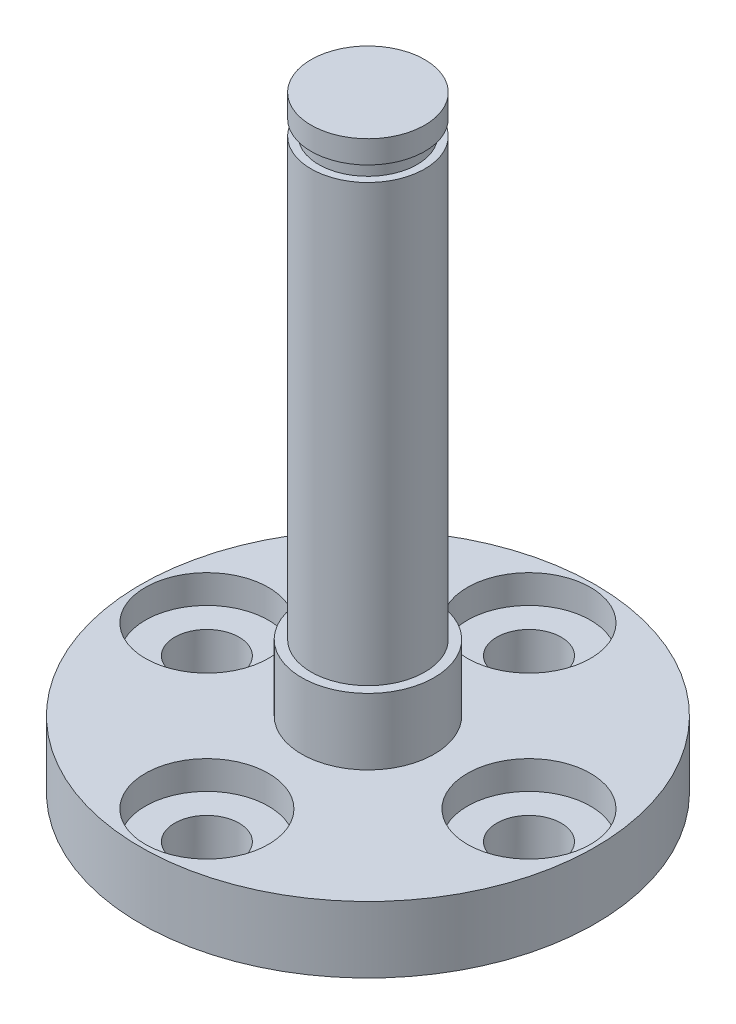
ISO-10303-21;
HEADER;
FILE_DESCRIPTION(('STEP AP214'),'2;1');
FILE_NAME('part.step','',(''),(''),'','','');
FILE_SCHEMA(('AUTOMOTIVE_DESIGN { 1 0 10303 214 1 1 1 1 }'));
ENDSEC;
DATA;
#1=APPLICATION_CONTEXT('core data for automotive mechanical design processes');
#2=APPLICATION_PROTOCOL_DEFINITION('international standard','automotive_design',2000,#1);
#3=PRODUCT_CONTEXT('',#1,'mechanical');
#4=PRODUCT('Part','Part','',(#3));
#5=PRODUCT_RELATED_PRODUCT_CATEGORY('part','',(#4));
#6=PRODUCT_DEFINITION_FORMATION('','',#4);
#7=PRODUCT_DEFINITION_CONTEXT('part definition',#1,'design');
#8=PRODUCT_DEFINITION('design','',#6,#7);
#9=PRODUCT_DEFINITION_SHAPE('','',#8);
#10=(LENGTH_UNIT() NAMED_UNIT(*) SI_UNIT(.MILLI.,.METRE.));
#11=(NAMED_UNIT(*) PLANE_ANGLE_UNIT() SI_UNIT($,.RADIAN.));
#12=(NAMED_UNIT(*) SI_UNIT($,.STERADIAN.) SOLID_ANGLE_UNIT());
#13=UNCERTAINTY_MEASURE_WITH_UNIT(LENGTH_MEASURE(1.E-05),#10,'distance_accuracy_value','');
#14=(GEOMETRIC_REPRESENTATION_CONTEXT(3) GLOBAL_UNCERTAINTY_ASSIGNED_CONTEXT((#13)) GLOBAL_UNIT_ASSIGNED_CONTEXT((#10,
#11,#12)) REPRESENTATION_CONTEXT('',''));
#15=CARTESIAN_POINT('',(0.,0.,0.));
#16=DIRECTION('',(0.,0.,1.));
#17=DIRECTION('',(1.,0.,0.));
#18=AXIS2_PLACEMENT_3D('',#15,#16,#17);
#19=CARTESIAN_POINT('',(0.,-3.5,0.));
#20=DIRECTION('',(0.,-1.,0.));
#21=DIRECTION('',(0.,0.,-1.));
#22=AXIS2_PLACEMENT_3D('',#19,#20,#21);
#23=PLANE('',#22);
#24=CARTESIAN_POINT('',(0.,-3.5,-8.5));
#25=DIRECTION('',(0.,-1.,0.));
#26=DIRECTION('',(0.,0.,-1.));
#27=AXIS2_PLACEMENT_3D('',#24,#25,#26);
#28=CIRCLE('',#27,1.7);
#29=CARTESIAN_POINT('',(0.,-3.5,-10.2));
#30=VERTEX_POINT('',#29);
#31=EDGE_CURVE('E40',#30,#30,#28,.T.);
#32=ORIENTED_EDGE('',*,*,#31,.F.);
#33=EDGE_LOOP('',(#32));
#34=FACE_BOUND('',#33,.T.);
#35=CARTESIAN_POINT('',(-8.5,-3.5,0.));
#36=DIRECTION('',(0.,-1.,0.));
#37=DIRECTION('',(0.,0.,-1.));
#38=AXIS2_PLACEMENT_3D('',#35,#36,#37);
#39=CIRCLE('',#38,1.7);
#40=CARTESIAN_POINT('',(-8.5,-3.5,-1.7));
#41=VERTEX_POINT('',#40);
#42=EDGE_CURVE('E67',#41,#41,#39,.T.);
#43=ORIENTED_EDGE('',*,*,#42,.F.);
#44=EDGE_LOOP('',(#43));
#45=FACE_BOUND('',#44,.T.);
#46=CARTESIAN_POINT('',(0.,-3.5,8.5));
#47=DIRECTION('',(0.,-1.,0.));
#48=DIRECTION('',(0.,0.,-1.));
#49=AXIS2_PLACEMENT_3D('',#46,#47,#48);
#50=CIRCLE('',#49,1.7);
#51=CARTESIAN_POINT('',(0.,-3.5,6.8));
#52=VERTEX_POINT('',#51);
#53=EDGE_CURVE('E62',#52,#52,#50,.T.);
#54=ORIENTED_EDGE('',*,*,#53,.F.);
#55=EDGE_LOOP('',(#54));
#56=FACE_BOUND('',#55,.T.);
#57=CARTESIAN_POINT('',(8.5,-3.5,0.));
#58=DIRECTION('',(0.,-1.,0.));
#59=DIRECTION('',(0.,0.,-1.));
#60=AXIS2_PLACEMENT_3D('',#57,#58,#59);
#61=CIRCLE('',#60,1.7);
#62=CARTESIAN_POINT('',(8.5,-3.5,-1.7));
#63=VERTEX_POINT('',#62);
#64=EDGE_CURVE('E56',#63,#63,#61,.T.);
#65=ORIENTED_EDGE('',*,*,#64,.F.);
#66=EDGE_LOOP('',(#65));
#67=FACE_BOUND('',#66,.T.);
#68=CARTESIAN_POINT('',(0.,-3.5,0.));
#69=DIRECTION('',(0.,-1.,0.));
#70=DIRECTION('',(0.,0.,-1.));
#71=AXIS2_PLACEMENT_3D('',#68,#69,#70);
#72=CIRCLE('',#71,12.);
#73=CARTESIAN_POINT('',(0.,-3.5,-12.));
#74=VERTEX_POINT('',#73);
#75=EDGE_CURVE('E114',#74,#74,#72,.T.);
#76=ORIENTED_EDGE('',*,*,#75,.T.);
#77=EDGE_LOOP('',(#76));
#78=FACE_BOUND('',#77,.T.);
#79=CARTESIAN_POINT('',(0.,-3.5,0.));
#80=DIRECTION('',(0.,-1.,0.));
#81=DIRECTION('',(0.,0.,-1.));
#82=AXIS2_PLACEMENT_3D('',#79,#80,#81);
#83=CIRCLE('',#82,2.95);
#84=CARTESIAN_POINT('',(0.,-3.5,-2.95));
#85=VERTEX_POINT('',#84);
#86=EDGE_CURVE('E60',#85,#85,#83,.T.);
#87=ORIENTED_EDGE('',*,*,#86,.F.);
#88=EDGE_LOOP('',(#87));
#89=FACE_BOUND('',#88,.T.);
#90=ADVANCED_FACE('F36',(#34,#45,#56,#67,#78,#89),#23,.T.);
#91=CARTESIAN_POINT('',(0.,0.,0.));
#92=DIRECTION('',(0.,-1.,0.));
#93=DIRECTION('',(0.,0.,-1.));
#94=AXIS2_PLACEMENT_3D('',#91,#92,#93);
#95=CYLINDRICAL_SURFACE('',#94,3.50000000000001);
#96=CARTESIAN_POINT('',(0.,3.5,0.));
#97=DIRECTION('',(0.,-1.,0.));
#98=DIRECTION('',(0.,0.,-1.));
#99=AXIS2_PLACEMENT_3D('',#96,#97,#98);
#100=CIRCLE('',#99,3.5);
#101=CARTESIAN_POINT('',(0.,3.5,-3.5));
#102=VERTEX_POINT('',#101);
#103=EDGE_CURVE('E45',#102,#102,#100,.T.);
#104=ORIENTED_EDGE('',*,*,#103,.T.);
#105=EDGE_LOOP('',(#104));
#106=FACE_BOUND('',#105,.T.);
#107=CARTESIAN_POINT('',(0.,0.,0.));
#108=DIRECTION('',(0.,-1.,0.));
#109=DIRECTION('',(0.,0.,-1.));
#110=AXIS2_PLACEMENT_3D('',#107,#108,#109);
#111=CIRCLE('',#110,3.50000000000001);
#112=CARTESIAN_POINT('',(0.,0.,-3.50000000000001));
#113=VERTEX_POINT('',#112);
#114=EDGE_CURVE('E10',#113,#113,#111,.T.);
#115=ORIENTED_EDGE('',*,*,#114,.F.);
#116=EDGE_LOOP('',(#115));
#117=FACE_BOUND('',#116,.T.);
#118=ADVANCED_FACE('F38',(#106,#117),#95,.T.);
#119=CARTESIAN_POINT('',(3.5,3.5,0.));
#120=DIRECTION('',(0.,1.,0.));
#121=DIRECTION('',(0.,0.,1.));
#122=AXIS2_PLACEMENT_3D('',#119,#120,#121);
#123=PLANE('',#122);
#124=CARTESIAN_POINT('',(0.,3.5,0.));
#125=DIRECTION('',(0.,-1.,0.));
#126=DIRECTION('',(0.,0.,-1.));
#127=AXIS2_PLACEMENT_3D('',#124,#125,#126);
#128=CIRCLE('',#127,3.);
#129=CARTESIAN_POINT('',(0.,3.5,-3.));
#130=VERTEX_POINT('',#129);
#131=EDGE_CURVE('E52',#130,#130,#128,.T.);
#132=ORIENTED_EDGE('',*,*,#131,.T.);
#133=EDGE_LOOP('',(#132));
#134=FACE_BOUND('',#133,.T.);
#135=ORIENTED_EDGE('',*,*,#103,.F.);
#136=EDGE_LOOP('',(#135));
#137=FACE_BOUND('',#136,.T.);
#138=ADVANCED_FACE('F143',(#134,#137),#123,.T.);
#139=CARTESIAN_POINT('',(0.,0.,0.));
#140=DIRECTION('',(0.,-1.,0.));
#141=DIRECTION('',(0.,0.,-1.));
#142=AXIS2_PLACEMENT_3D('',#139,#140,#141);
#143=CYLINDRICAL_SURFACE('',#142,3.);
#144=CARTESIAN_POINT('',(0.,26.5,0.));
#145=DIRECTION('',(0.,-1.,0.));
#146=DIRECTION('',(0.,0.,-1.));
#147=AXIS2_PLACEMENT_3D('',#144,#145,#146);
#148=CIRCLE('',#147,3.);
#149=CARTESIAN_POINT('',(0.,26.5,-3.));
#150=VERTEX_POINT('',#149);
#151=EDGE_CURVE('E137',#150,#150,#148,.T.);
#152=ORIENTED_EDGE('',*,*,#151,.T.);
#153=EDGE_LOOP('',(#152));
#154=FACE_BOUND('',#153,.T.);
#155=ORIENTED_EDGE('',*,*,#131,.F.);
#156=EDGE_LOOP('',(#155));
#157=FACE_BOUND('',#156,.T.);
#158=ADVANCED_FACE('F146',(#154,#157),#143,.T.);
#159=CARTESIAN_POINT('',(3.,26.5,0.));
#160=DIRECTION('',(0.,1.,0.));
#161=DIRECTION('',(0.,0.,1.));
#162=AXIS2_PLACEMENT_3D('',#159,#160,#161);
#163=PLANE('',#162);
#164=CARTESIAN_POINT('',(0.,26.5,0.));
#165=DIRECTION('',(0.,-1.,0.));
#166=DIRECTION('',(0.,0.,-1.));
#167=AXIS2_PLACEMENT_3D('',#164,#165,#166);
#168=CIRCLE('',#167,2.6);
#169=CARTESIAN_POINT('',(0.,26.5,-2.6));
#170=VERTEX_POINT('',#169);
#171=EDGE_CURVE('E133',#170,#170,#168,.T.);
#172=ORIENTED_EDGE('',*,*,#171,.T.);
#173=EDGE_LOOP('',(#172));
#174=FACE_BOUND('',#173,.T.);
#175=ORIENTED_EDGE('',*,*,#151,.F.);
#176=EDGE_LOOP('',(#175));
#177=FACE_BOUND('',#176,.T.);
#178=ADVANCED_FACE('F148',(#174,#177),#163,.T.);
#179=CARTESIAN_POINT('',(0.,0.,0.));
#180=DIRECTION('',(0.,-1.,0.));
#181=DIRECTION('',(0.,0.,-1.));
#182=AXIS2_PLACEMENT_3D('',#179,#180,#181);
#183=CYLINDRICAL_SURFACE('',#182,2.6);
#184=CARTESIAN_POINT('',(0.,27.3,0.));
#185=DIRECTION('',(0.,-1.,0.));
#186=DIRECTION('',(0.,0.,-1.));
#187=AXIS2_PLACEMENT_3D('',#184,#185,#186);
#188=CIRCLE('',#187,2.6);
#189=CARTESIAN_POINT('',(0.,27.3,-2.6));
#190=VERTEX_POINT('',#189);
#191=EDGE_CURVE('E129',#190,#190,#188,.T.);
#192=ORIENTED_EDGE('',*,*,#191,.T.);
#193=EDGE_LOOP('',(#192));
#194=FACE_BOUND('',#193,.T.);
#195=ORIENTED_EDGE('',*,*,#171,.F.);
#196=EDGE_LOOP('',(#195));
#197=FACE_BOUND('',#196,.T.);
#198=ADVANCED_FACE('F155',(#194,#197),#183,.T.);
#199=CARTESIAN_POINT('',(3.,27.3,0.));
#200=DIRECTION('',(0.,-1.,0.));
#201=DIRECTION('',(0.,0.,-1.));
#202=AXIS2_PLACEMENT_3D('',#199,#200,#201);
#203=PLANE('',#202);
#204=CARTESIAN_POINT('',(0.,27.3,0.));
#205=DIRECTION('',(0.,-1.,0.));
#206=DIRECTION('',(0.,0.,-1.));
#207=AXIS2_PLACEMENT_3D('',#204,#205,#206);
#208=CIRCLE('',#207,3.);
#209=CARTESIAN_POINT('',(0.,27.3,-3.));
#210=VERTEX_POINT('',#209);
#211=EDGE_CURVE('E125',#210,#210,#208,.T.);
#212=ORIENTED_EDGE('',*,*,#211,.T.);
#213=EDGE_LOOP('',(#212));
#214=FACE_BOUND('',#213,.T.);
#215=ORIENTED_EDGE('',*,*,#191,.F.);
#216=EDGE_LOOP('',(#215));
#217=FACE_BOUND('',#216,.T.);
#218=ADVANCED_FACE('F186',(#214,#217),#203,.T.);
#219=CARTESIAN_POINT('',(0.,0.,0.));
#220=DIRECTION('',(0.,-1.,0.));
#221=DIRECTION('',(0.,0.,-1.));
#222=AXIS2_PLACEMENT_3D('',#219,#220,#221);
#223=CYLINDRICAL_SURFACE('',#222,3.);
#224=CARTESIAN_POINT('',(0.,28.5,0.));
#225=DIRECTION('',(0.,-1.,0.));
#226=DIRECTION('',(0.,0.,-1.));
#227=AXIS2_PLACEMENT_3D('',#224,#225,#226);
#228=CIRCLE('',#227,3.);
#229=CARTESIAN_POINT('',(0.,28.5,-3.));
#230=VERTEX_POINT('',#229);
#231=EDGE_CURVE('E118',#230,#230,#228,.T.);
#232=ORIENTED_EDGE('',*,*,#231,.T.);
#233=EDGE_LOOP('',(#232));
#234=FACE_BOUND('',#233,.T.);
#235=ORIENTED_EDGE('',*,*,#211,.F.);
#236=EDGE_LOOP('',(#235));
#237=FACE_BOUND('',#236,.T.);
#238=ADVANCED_FACE('F182',(#234,#237),#223,.T.);
#239=CARTESIAN_POINT('',(3.,28.5,0.));
#240=DIRECTION('',(0.,1.,0.));
#241=DIRECTION('',(0.,0.,1.));
#242=AXIS2_PLACEMENT_3D('',#239,#240,#241);
#243=PLANE('',#242);
#244=ORIENTED_EDGE('',*,*,#231,.F.);
#245=EDGE_LOOP('',(#244));
#246=FACE_BOUND('',#245,.T.);
#247=ADVANCED_FACE('F178',(#246),#243,.T.);
#248=CARTESIAN_POINT('',(0.,-3.5,0.));
#249=DIRECTION('',(0.,1.,0.));
#250=DIRECTION('',(0.,0.,1.));
#251=AXIS2_PLACEMENT_3D('',#248,#249,#250);
#252=CYLINDRICAL_SURFACE('',#251,12.);
#253=ORIENTED_EDGE('',*,*,#75,.F.);
#254=EDGE_LOOP('',(#253));
#255=FACE_BOUND('',#254,.T.);
#256=CARTESIAN_POINT('',(0.,0.,0.));
#257=DIRECTION('',(0.,-1.,0.));
#258=DIRECTION('',(0.,0.,-1.));
#259=AXIS2_PLACEMENT_3D('',#256,#257,#258);
#260=CIRCLE('',#259,12.);
#261=CARTESIAN_POINT('',(0.,0.,-12.));
#262=VERTEX_POINT('',#261);
#263=EDGE_CURVE('E110',#262,#262,#260,.T.);
#264=ORIENTED_EDGE('',*,*,#263,.T.);
#265=EDGE_LOOP('',(#264));
#266=FACE_BOUND('',#265,.T.);
#267=ADVANCED_FACE('F174',(#255,#266),#252,.T.);
#268=CARTESIAN_POINT('',(0.,0.,0.));
#269=DIRECTION('',(0.,-1.,0.));
#270=DIRECTION('',(0.,0.,-1.));
#271=AXIS2_PLACEMENT_3D('',#268,#269,#270);
#272=PLANE('',#271);
#273=CARTESIAN_POINT('',(0.,0.,-8.5));
#274=DIRECTION('',(0.,1.,0.));
#275=DIRECTION('',(0.,0.,1.));
#276=AXIS2_PLACEMENT_3D('',#273,#274,#275);
#277=CIRCLE('',#276,3.25);
#278=CARTESIAN_POINT('',(0.,0.,-5.25));
#279=VERTEX_POINT('',#278);
#280=EDGE_CURVE('E428',#279,#279,#277,.T.);
#281=ORIENTED_EDGE('',*,*,#280,.F.);
#282=EDGE_LOOP('',(#281));
#283=FACE_BOUND('',#282,.T.);
#284=CARTESIAN_POINT('',(-8.5,0.,0.));
#285=DIRECTION('',(0.,1.,0.));
#286=DIRECTION('',(0.,0.,1.));
#287=AXIS2_PLACEMENT_3D('',#284,#285,#286);
#288=CIRCLE('',#287,3.25);
#289=CARTESIAN_POINT('',(-8.5,0.,3.25));
#290=VERTEX_POINT('',#289);
#291=EDGE_CURVE('E88',#290,#290,#288,.T.);
#292=ORIENTED_EDGE('',*,*,#291,.F.);
#293=EDGE_LOOP('',(#292));
#294=FACE_BOUND('',#293,.T.);
#295=CARTESIAN_POINT('',(0.,0.,8.5));
#296=DIRECTION('',(0.,1.,0.));
#297=DIRECTION('',(0.,0.,1.));
#298=AXIS2_PLACEMENT_3D('',#295,#296,#297);
#299=CIRCLE('',#298,3.25);
#300=CARTESIAN_POINT('',(0.,0.,11.75));
#301=VERTEX_POINT('',#300);
#302=EDGE_CURVE('E70',#301,#301,#299,.T.);
#303=ORIENTED_EDGE('',*,*,#302,.F.);
#304=EDGE_LOOP('',(#303));
#305=FACE_BOUND('',#304,.T.);
#306=CARTESIAN_POINT('',(8.5,0.,0.));
#307=DIRECTION('',(0.,1.,0.));
#308=DIRECTION('',(0.,0.,1.));
#309=AXIS2_PLACEMENT_3D('',#306,#307,#308);
#310=CIRCLE('',#309,3.25);
#311=CARTESIAN_POINT('',(8.5,0.,3.25));
#312=VERTEX_POINT('',#311);
#313=EDGE_CURVE('E65',#312,#312,#310,.T.);
#314=ORIENTED_EDGE('',*,*,#313,.F.);
#315=EDGE_LOOP('',(#314));
#316=FACE_BOUND('',#315,.T.);
#317=ORIENTED_EDGE('',*,*,#114,.T.);
#318=EDGE_LOOP('',(#317));
#319=FACE_BOUND('',#318,.T.);
#320=ORIENTED_EDGE('',*,*,#263,.F.);
#321=EDGE_LOOP('',(#320));
#322=FACE_BOUND('',#321,.T.);
#323=ADVANCED_FACE('F171',(#283,#294,#305,#316,#319,#322),#272,.F.);
#324=CARTESIAN_POINT('',(0.,-5.5,0.));
#325=DIRECTION('',(0.,1.,0.));
#326=DIRECTION('',(0.,0.,1.));
#327=AXIS2_PLACEMENT_3D('',#324,#325,#326);
#328=CYLINDRICAL_SURFACE('',#327,2.95);
#329=CARTESIAN_POINT('',(0.,-5.5,0.));
#330=DIRECTION('',(0.,-1.,0.));
#331=DIRECTION('',(0.,0.,-1.));
#332=AXIS2_PLACEMENT_3D('',#329,#330,#331);
#333=CIRCLE('',#332,2.95);
#334=CARTESIAN_POINT('',(0.,-5.5,-2.95));
#335=VERTEX_POINT('',#334);
#336=EDGE_CURVE('E106',#335,#335,#333,.T.);
#337=ORIENTED_EDGE('',*,*,#336,.F.);
#338=EDGE_LOOP('',(#337));
#339=FACE_BOUND('',#338,.T.);
#340=ORIENTED_EDGE('',*,*,#86,.T.);
#341=EDGE_LOOP('',(#340));
#342=FACE_BOUND('',#341,.T.);
#343=ADVANCED_FACE('F169',(#339,#342),#328,.T.);
#344=CARTESIAN_POINT('',(0.,-5.5,0.));
#345=DIRECTION('',(0.,-1.,0.));
#346=DIRECTION('',(0.,0.,-1.));
#347=AXIS2_PLACEMENT_3D('',#344,#345,#346);
#348=PLANE('',#347);
#349=ORIENTED_EDGE('',*,*,#336,.T.);
#350=EDGE_LOOP('',(#349));
#351=FACE_BOUND('',#350,.T.);
#352=ADVANCED_FACE('F223',(#351),#348,.T.);
#353=CARTESIAN_POINT('',(8.5,0.,0.));
#354=DIRECTION('',(0.,1.,0.));
#355=DIRECTION('',(0.,0.,1.));
#356=AXIS2_PLACEMENT_3D('',#353,#354,#355);
#357=CYLINDRICAL_SURFACE('',#356,1.7);
#358=ORIENTED_EDGE('',*,*,#64,.T.);
#359=EDGE_LOOP('',(#358));
#360=FACE_BOUND('',#359,.T.);
#361=CARTESIAN_POINT('',(8.5,-1.5,0.));
#362=DIRECTION('',(0.,1.,0.));
#363=DIRECTION('',(0.,0.,1.));
#364=AXIS2_PLACEMENT_3D('',#361,#362,#363);
#365=CIRCLE('',#364,1.7);
#366=CARTESIAN_POINT('',(8.5,-1.5,1.7));
#367=VERTEX_POINT('',#366);
#368=EDGE_CURVE('E61',#367,#367,#365,.T.);
#369=ORIENTED_EDGE('',*,*,#368,.T.);
#370=EDGE_LOOP('',(#369));
#371=FACE_BOUND('',#370,.T.);
#372=ADVANCED_FACE('F229',(#360,#371),#357,.F.);
#373=CARTESIAN_POINT('',(10.2,-1.5,0.));
#374=DIRECTION('',(0.,-1.,0.));
#375=DIRECTION('',(0.,0.,-1.));
#376=AXIS2_PLACEMENT_3D('',#373,#374,#375);
#377=PLANE('',#376);
#378=ORIENTED_EDGE('',*,*,#368,.F.);
#379=EDGE_LOOP('',(#378));
#380=FACE_BOUND('',#379,.T.);
#381=CARTESIAN_POINT('',(8.5,-1.5,0.));
#382=DIRECTION('',(0.,1.,0.));
#383=DIRECTION('',(0.,0.,1.));
#384=AXIS2_PLACEMENT_3D('',#381,#382,#383);
#385=CIRCLE('',#384,3.25);
#386=CARTESIAN_POINT('',(8.5,-1.5,3.25));
#387=VERTEX_POINT('',#386);
#388=EDGE_CURVE('E100',#387,#387,#385,.T.);
#389=ORIENTED_EDGE('',*,*,#388,.T.);
#390=EDGE_LOOP('',(#389));
#391=FACE_BOUND('',#390,.T.);
#392=ADVANCED_FACE('F235',(#380,#391),#377,.F.);
#393=CARTESIAN_POINT('',(8.5,0.,0.));
#394=DIRECTION('',(0.,1.,0.));
#395=DIRECTION('',(0.,0.,1.));
#396=AXIS2_PLACEMENT_3D('',#393,#394,#395);
#397=CYLINDRICAL_SURFACE('',#396,3.25);
#398=ORIENTED_EDGE('',*,*,#388,.F.);
#399=EDGE_LOOP('',(#398));
#400=FACE_BOUND('',#399,.T.);
#401=ORIENTED_EDGE('',*,*,#313,.T.);
#402=EDGE_LOOP('',(#401));
#403=FACE_BOUND('',#402,.T.);
#404=ADVANCED_FACE('F242',(#400,#403),#397,.F.);
#405=CARTESIAN_POINT('',(0.,0.,8.5));
#406=DIRECTION('',(0.,1.,0.));
#407=DIRECTION('',(0.,0.,1.));
#408=AXIS2_PLACEMENT_3D('',#405,#406,#407);
#409=CYLINDRICAL_SURFACE('',#408,1.7);
#410=ORIENTED_EDGE('',*,*,#53,.T.);
#411=EDGE_LOOP('',(#410));
#412=FACE_BOUND('',#411,.T.);
#413=CARTESIAN_POINT('',(0.,-1.5,8.5));
#414=DIRECTION('',(0.,1.,0.));
#415=DIRECTION('',(0.,0.,1.));
#416=AXIS2_PLACEMENT_3D('',#413,#414,#415);
#417=CIRCLE('',#416,1.7);
#418=CARTESIAN_POINT('',(0.,-1.5,10.2));
#419=VERTEX_POINT('',#418);
#420=EDGE_CURVE('E66',#419,#419,#417,.T.);
#421=ORIENTED_EDGE('',*,*,#420,.T.);
#422=EDGE_LOOP('',(#421));
#423=FACE_BOUND('',#422,.T.);
#424=ADVANCED_FACE('F249',(#412,#423),#409,.F.);
#425=CARTESIAN_POINT('',(1.69999999999997,-1.5,8.5));
#426=DIRECTION('',(0.,-1.,0.));
#427=DIRECTION('',(0.,0.,-1.));
#428=AXIS2_PLACEMENT_3D('',#425,#426,#427);
#429=PLANE('',#428);
#430=ORIENTED_EDGE('',*,*,#420,.F.);
#431=EDGE_LOOP('',(#430));
#432=FACE_BOUND('',#431,.T.);
#433=CARTESIAN_POINT('',(0.,-1.5,8.5));
#434=DIRECTION('',(0.,1.,0.));
#435=DIRECTION('',(0.,0.,1.));
#436=AXIS2_PLACEMENT_3D('',#433,#434,#435);
#437=CIRCLE('',#436,3.25);
#438=CARTESIAN_POINT('',(0.,-1.5,11.75));
#439=VERTEX_POINT('',#438);
#440=EDGE_CURVE('E78',#439,#439,#437,.T.);
#441=ORIENTED_EDGE('',*,*,#440,.T.);
#442=EDGE_LOOP('',(#441));
#443=FACE_BOUND('',#442,.T.);
#444=ADVANCED_FACE('F256',(#432,#443),#429,.F.);
#445=CARTESIAN_POINT('',(0.,0.,8.5));
#446=DIRECTION('',(0.,1.,0.));
#447=DIRECTION('',(0.,0.,1.));
#448=AXIS2_PLACEMENT_3D('',#445,#446,#447);
#449=CYLINDRICAL_SURFACE('',#448,3.25);
#450=ORIENTED_EDGE('',*,*,#440,.F.);
#451=EDGE_LOOP('',(#450));
#452=FACE_BOUND('',#451,.T.);
#453=ORIENTED_EDGE('',*,*,#302,.T.);
#454=EDGE_LOOP('',(#453));
#455=FACE_BOUND('',#454,.T.);
#456=ADVANCED_FACE('F263',(#452,#455),#449,.F.);
#457=CARTESIAN_POINT('',(-8.5,0.,0.));
#458=DIRECTION('',(0.,1.,0.));
#459=DIRECTION('',(0.,0.,1.));
#460=AXIS2_PLACEMENT_3D('',#457,#458,#459);
#461=CYLINDRICAL_SURFACE('',#460,1.7);
#462=ORIENTED_EDGE('',*,*,#42,.T.);
#463=EDGE_LOOP('',(#462));
#464=FACE_BOUND('',#463,.T.);
#465=CARTESIAN_POINT('',(-8.5,-1.5,0.));
#466=DIRECTION('',(0.,1.,0.));
#467=DIRECTION('',(0.,0.,1.));
#468=AXIS2_PLACEMENT_3D('',#465,#466,#467);
#469=CIRCLE('',#468,1.7);
#470=CARTESIAN_POINT('',(-8.5,-1.5,1.7));
#471=VERTEX_POINT('',#470);
#472=EDGE_CURVE('E71',#471,#471,#469,.T.);
#473=ORIENTED_EDGE('',*,*,#472,.T.);
#474=EDGE_LOOP('',(#473));
#475=FACE_BOUND('',#474,.T.);
#476=ADVANCED_FACE('F270',(#464,#475),#461,.F.);
#477=CARTESIAN_POINT('',(-6.8,-1.5,0.));
#478=DIRECTION('',(0.,-1.,0.));
#479=DIRECTION('',(0.,0.,-1.));
#480=AXIS2_PLACEMENT_3D('',#477,#478,#479);
#481=PLANE('',#480);
#482=ORIENTED_EDGE('',*,*,#472,.F.);
#483=EDGE_LOOP('',(#482));
#484=FACE_BOUND('',#483,.T.);
#485=CARTESIAN_POINT('',(-8.5,-1.5,0.));
#486=DIRECTION('',(0.,1.,0.));
#487=DIRECTION('',(0.,0.,1.));
#488=AXIS2_PLACEMENT_3D('',#485,#486,#487);
#489=CIRCLE('',#488,3.25);
#490=CARTESIAN_POINT('',(-8.5,-1.5,3.25));
#491=VERTEX_POINT('',#490);
#492=EDGE_CURVE('E82',#491,#491,#489,.T.);
#493=ORIENTED_EDGE('',*,*,#492,.T.);
#494=EDGE_LOOP('',(#493));
#495=FACE_BOUND('',#494,.T.);
#496=ADVANCED_FACE('F277',(#484,#495),#481,.F.);
#497=CARTESIAN_POINT('',(-8.5,0.,0.));
#498=DIRECTION('',(0.,1.,0.));
#499=DIRECTION('',(0.,0.,1.));
#500=AXIS2_PLACEMENT_3D('',#497,#498,#499);
#501=CYLINDRICAL_SURFACE('',#500,3.25);
#502=ORIENTED_EDGE('',*,*,#492,.F.);
#503=EDGE_LOOP('',(#502));
#504=FACE_BOUND('',#503,.T.);
#505=ORIENTED_EDGE('',*,*,#291,.T.);
#506=EDGE_LOOP('',(#505));
#507=FACE_BOUND('',#506,.T.);
#508=ADVANCED_FACE('F283',(#504,#507),#501,.F.);
#509=CARTESIAN_POINT('',(0.,0.,-8.5));
#510=DIRECTION('',(0.,1.,0.));
#511=DIRECTION('',(0.,0.,1.));
#512=AXIS2_PLACEMENT_3D('',#509,#510,#511);
#513=CYLINDRICAL_SURFACE('',#512,1.7);
#514=ORIENTED_EDGE('',*,*,#31,.T.);
#515=EDGE_LOOP('',(#514));
#516=FACE_BOUND('',#515,.T.);
#517=CARTESIAN_POINT('',(0.,-1.5,-8.5));
#518=DIRECTION('',(0.,1.,0.));
#519=DIRECTION('',(0.,0.,1.));
#520=AXIS2_PLACEMENT_3D('',#517,#518,#519);
#521=CIRCLE('',#520,1.7);
#522=CARTESIAN_POINT('',(0.,-1.5,-6.8));
#523=VERTEX_POINT('',#522);
#524=EDGE_CURVE('E433',#523,#523,#521,.T.);
#525=ORIENTED_EDGE('',*,*,#524,.T.);
#526=EDGE_LOOP('',(#525));
#527=FACE_BOUND('',#526,.T.);
#528=ADVANCED_FACE('F290',(#516,#527),#513,.F.);
#529=CARTESIAN_POINT('',(1.70000000000009,-1.5,-8.5));
#530=DIRECTION('',(0.,-1.,0.));
#531=DIRECTION('',(0.,0.,-1.));
#532=AXIS2_PLACEMENT_3D('',#529,#530,#531);
#533=PLANE('',#532);
#534=ORIENTED_EDGE('',*,*,#524,.F.);
#535=EDGE_LOOP('',(#534));
#536=FACE_BOUND('',#535,.T.);
#537=CARTESIAN_POINT('',(0.,-1.5,-8.5));
#538=DIRECTION('',(0.,1.,0.));
#539=DIRECTION('',(0.,0.,1.));
#540=AXIS2_PLACEMENT_3D('',#537,#538,#539);
#541=CIRCLE('',#540,3.25);
#542=CARTESIAN_POINT('',(0.,-1.5,-5.25));
#543=VERTEX_POINT('',#542);
#544=EDGE_CURVE('E425',#543,#543,#541,.T.);
#545=ORIENTED_EDGE('',*,*,#544,.T.);
#546=EDGE_LOOP('',(#545));
#547=FACE_BOUND('',#546,.T.);
#548=ADVANCED_FACE('F297',(#536,#547),#533,.F.);
#549=CARTESIAN_POINT('',(0.,0.,-8.5));
#550=DIRECTION('',(0.,1.,0.));
#551=DIRECTION('',(0.,0.,1.));
#552=AXIS2_PLACEMENT_3D('',#549,#550,#551);
#553=CYLINDRICAL_SURFACE('',#552,3.25);
#554=ORIENTED_EDGE('',*,*,#544,.F.);
#555=EDGE_LOOP('',(#554));
#556=FACE_BOUND('',#555,.T.);
#557=ORIENTED_EDGE('',*,*,#280,.T.);
#558=EDGE_LOOP('',(#557));
#559=FACE_BOUND('',#558,.T.);
#560=ADVANCED_FACE('F304',(#556,#559),#553,.F.);
#561=CLOSED_SHELL('',(#90,#118,#138,#158,#178,#198,#218,#238,#247,#267,#323,#343,#352,#372,#392,
#404,#424,#444,#456,#476,#496,#508,#528,#548,#560));
#562=MANIFOLD_SOLID_BREP('B2',#561);
#563=ADVANCED_BREP_SHAPE_REPRESENTATION('',(#18,#562),#14);
#564=SHAPE_DEFINITION_REPRESENTATION(#9,#563);
ENDSEC;
END-ISO-10303-21;
